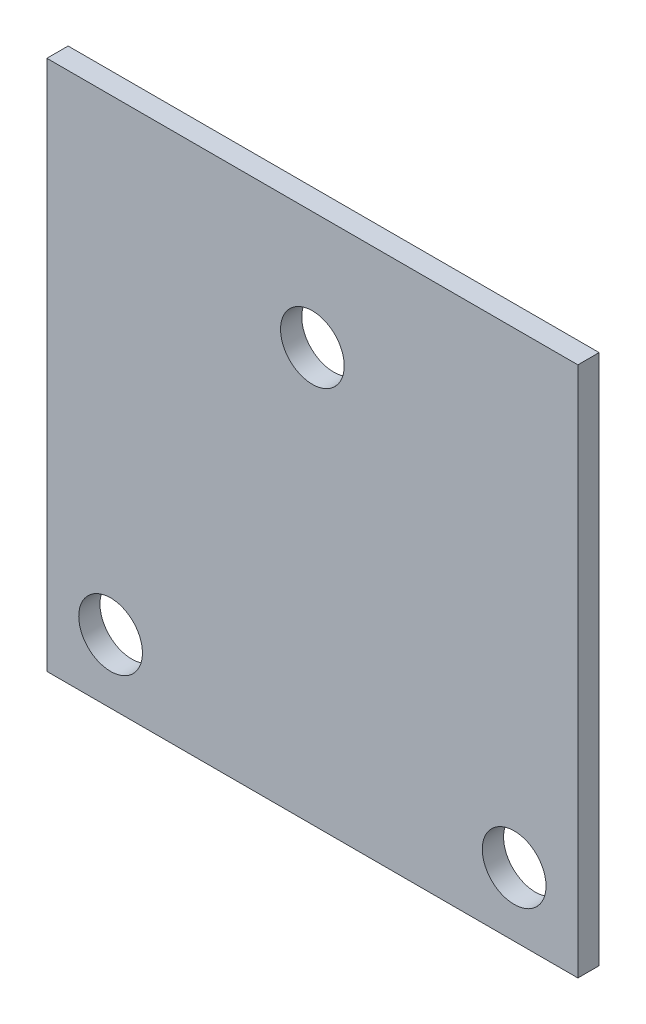
ISO-10303-21;
HEADER;
FILE_DESCRIPTION(('STEP AP214'),'2;1');
FILE_NAME('part.step','',(''),(''),'','','');
FILE_SCHEMA(('AUTOMOTIVE_DESIGN { 1 0 10303 214 1 1 1 1 }'));
ENDSEC;
DATA;
#1=APPLICATION_CONTEXT('core data for automotive mechanical design processes');
#2=APPLICATION_PROTOCOL_DEFINITION('international standard','automotive_design',2000,#1);
#3=PRODUCT_CONTEXT('',#1,'mechanical');
#4=PRODUCT('Part','Part','',(#3));
#5=PRODUCT_RELATED_PRODUCT_CATEGORY('part','',(#4));
#6=PRODUCT_DEFINITION_FORMATION('','',#4);
#7=PRODUCT_DEFINITION_CONTEXT('part definition',#1,'design');
#8=PRODUCT_DEFINITION('design','',#6,#7);
#9=PRODUCT_DEFINITION_SHAPE('','',#8);
#10=(LENGTH_UNIT() NAMED_UNIT(*) SI_UNIT(.MILLI.,.METRE.));
#11=(NAMED_UNIT(*) PLANE_ANGLE_UNIT() SI_UNIT($,.RADIAN.));
#12=(NAMED_UNIT(*) SI_UNIT($,.STERADIAN.) SOLID_ANGLE_UNIT());
#13=UNCERTAINTY_MEASURE_WITH_UNIT(LENGTH_MEASURE(1.E-05),#10,'distance_accuracy_value','');
#14=(GEOMETRIC_REPRESENTATION_CONTEXT(3) GLOBAL_UNCERTAINTY_ASSIGNED_CONTEXT((#13)) GLOBAL_UNIT_ASSIGNED_CONTEXT((#10,
#11,#12)) REPRESENTATION_CONTEXT('',''));
#15=CARTESIAN_POINT('',(0.,0.,0.));
#16=DIRECTION('',(0.,0.,1.));
#17=DIRECTION('',(1.,0.,0.));
#18=AXIS2_PLACEMENT_3D('',#15,#16,#17);
#19=CARTESIAN_POINT('',(0.,0.,1.));
#20=DIRECTION('',(0.,0.,1.));
#21=DIRECTION('',(1.,0.,0.));
#22=AXIS2_PLACEMENT_3D('',#19,#20,#21);
#23=PLANE('',#22);
#24=CARTESIAN_POINT('',(-9.5,-9.50000000000001,1.));
#25=DIRECTION('',(0.,0.,1.));
#26=DIRECTION('',(-1.,0.,0.));
#27=AXIS2_PLACEMENT_3D('',#24,#25,#26);
#28=CIRCLE('',#27,1.5);
#29=CARTESIAN_POINT('',(-11.,-9.50000000000001,1.));
#30=VERTEX_POINT('',#29);
#31=EDGE_CURVE('E138',#30,#30,#28,.T.);
#32=ORIENTED_EDGE('',*,*,#31,.F.);
#33=EDGE_LOOP('',(#32));
#34=FACE_BOUND('',#33,.T.);
#35=DIRECTION('',(0.,-1.,0.));
#36=VECTOR('',#35,1.);
#37=CARTESIAN_POINT('',(-12.5,-12.5,1.));
#38=LINE('',#37,#36);
#39=CARTESIAN_POINT('',(-12.5,12.5,1.));
#40=VERTEX_POINT('',#39);
#41=CARTESIAN_POINT('',(-12.5,-12.5,1.));
#42=VERTEX_POINT('',#41);
#43=EDGE_CURVE('E96',#40,#42,#38,.T.);
#44=ORIENTED_EDGE('',*,*,#43,.T.);
#45=DIRECTION('',(1.,0.,0.));
#46=VECTOR('',#45,1.);
#47=CARTESIAN_POINT('',(12.5,-12.5,1.));
#48=LINE('',#47,#46);
#49=CARTESIAN_POINT('',(12.5,-12.5,1.));
#50=VERTEX_POINT('',#49);
#51=EDGE_CURVE('E91',#42,#50,#48,.T.);
#52=ORIENTED_EDGE('',*,*,#51,.T.);
#53=DIRECTION('',(0.,1.,0.));
#54=VECTOR('',#53,1.);
#55=CARTESIAN_POINT('',(12.5,-12.5,1.));
#56=LINE('',#55,#54);
#57=CARTESIAN_POINT('',(12.5,12.5,1.));
#58=VERTEX_POINT('',#57);
#59=EDGE_CURVE('E94',#50,#58,#56,.T.);
#60=ORIENTED_EDGE('',*,*,#59,.T.);
#61=DIRECTION('',(-1.,0.,0.));
#62=VECTOR('',#61,1.);
#63=CARTESIAN_POINT('',(12.5,12.5,1.));
#64=LINE('',#63,#62);
#65=EDGE_CURVE('E61',#58,#40,#64,.T.);
#66=ORIENTED_EDGE('',*,*,#65,.T.);
#67=EDGE_LOOP('',(#44,#52,#60,#66));
#68=FACE_BOUND('',#67,.T.);
#69=CARTESIAN_POINT('',(9.5,-9.5,1.));
#70=DIRECTION('',(0.,0.,1.));
#71=DIRECTION('',(1.,0.,0.));
#72=AXIS2_PLACEMENT_3D('',#69,#70,#71);
#73=CIRCLE('',#72,1.5);
#74=CARTESIAN_POINT('',(11.,-9.5,1.));
#75=VERTEX_POINT('',#74);
#76=EDGE_CURVE('E116',#75,#75,#73,.T.);
#77=ORIENTED_EDGE('',*,*,#76,.F.);
#78=EDGE_LOOP('',(#77));
#79=FACE_BOUND('',#78,.T.);
#80=CARTESIAN_POINT('',(0.,6.95448267190433,1.));
#81=DIRECTION('',(0.,0.,1.));
#82=DIRECTION('',(1.,0.,0.));
#83=AXIS2_PLACEMENT_3D('',#80,#81,#82);
#84=CIRCLE('',#83,1.5);
#85=CARTESIAN_POINT('',(1.5,6.95448267190433,1.));
#86=VERTEX_POINT('',#85);
#87=EDGE_CURVE('E146',#86,#86,#84,.T.);
#88=ORIENTED_EDGE('',*,*,#87,.F.);
#89=EDGE_LOOP('',(#88));
#90=FACE_BOUND('',#89,.T.);
#91=ADVANCED_FACE('F43',(#34,#68,#79,#90),#23,.T.);
#92=CARTESIAN_POINT('',(0.,0.,0.));
#93=DIRECTION('',(0.,0.,1.));
#94=DIRECTION('',(1.,0.,0.));
#95=AXIS2_PLACEMENT_3D('',#92,#93,#94);
#96=PLANE('',#95);
#97=DIRECTION('',(0.,-1.,0.));
#98=VECTOR('',#97,1.);
#99=CARTESIAN_POINT('',(-12.5,-12.5,0.));
#100=LINE('',#99,#98);
#101=CARTESIAN_POINT('',(-12.5,12.5,0.));
#102=VERTEX_POINT('',#101);
#103=CARTESIAN_POINT('',(-12.5,-12.5,0.));
#104=VERTEX_POINT('',#103);
#105=EDGE_CURVE('E112',#102,#104,#100,.T.);
#106=ORIENTED_EDGE('',*,*,#105,.F.);
#107=DIRECTION('',(-1.,0.,0.));
#108=VECTOR('',#107,1.);
#109=CARTESIAN_POINT('',(12.5,12.5,0.));
#110=LINE('',#109,#108);
#111=CARTESIAN_POINT('',(12.5,12.5,0.));
#112=VERTEX_POINT('',#111);
#113=EDGE_CURVE('E84',#112,#102,#110,.T.);
#114=ORIENTED_EDGE('',*,*,#113,.F.);
#115=DIRECTION('',(0.,1.,0.));
#116=VECTOR('',#115,1.);
#117=CARTESIAN_POINT('',(12.5,-12.5,0.));
#118=LINE('',#117,#116);
#119=CARTESIAN_POINT('',(12.5,-12.5,0.));
#120=VERTEX_POINT('',#119);
#121=EDGE_CURVE('E78',#120,#112,#118,.T.);
#122=ORIENTED_EDGE('',*,*,#121,.F.);
#123=DIRECTION('',(1.,0.,0.));
#124=VECTOR('',#123,1.);
#125=CARTESIAN_POINT('',(12.5,-12.5,0.));
#126=LINE('',#125,#124);
#127=EDGE_CURVE('E101',#104,#120,#126,.T.);
#128=ORIENTED_EDGE('',*,*,#127,.F.);
#129=EDGE_LOOP('',(#106,#114,#122,#128));
#130=FACE_BOUND('',#129,.T.);
#131=CARTESIAN_POINT('',(9.5,-9.5,0.));
#132=DIRECTION('',(0.,0.,1.));
#133=DIRECTION('',(1.,0.,0.));
#134=AXIS2_PLACEMENT_3D('',#131,#132,#133);
#135=CIRCLE('',#134,1.5);
#136=CARTESIAN_POINT('',(11.,-9.5,0.));
#137=VERTEX_POINT('',#136);
#138=EDGE_CURVE('E134',#137,#137,#135,.T.);
#139=ORIENTED_EDGE('',*,*,#138,.T.);
#140=EDGE_LOOP('',(#139));
#141=FACE_BOUND('',#140,.T.);
#142=CARTESIAN_POINT('',(-9.5,-9.50000000000001,0.));
#143=DIRECTION('',(0.,0.,1.));
#144=DIRECTION('',(-1.,0.,0.));
#145=AXIS2_PLACEMENT_3D('',#142,#143,#144);
#146=CIRCLE('',#145,1.5);
#147=CARTESIAN_POINT('',(-11.,-9.50000000000001,0.));
#148=VERTEX_POINT('',#147);
#149=EDGE_CURVE('E142',#148,#148,#146,.T.);
#150=ORIENTED_EDGE('',*,*,#149,.T.);
#151=EDGE_LOOP('',(#150));
#152=FACE_BOUND('',#151,.T.);
#153=CARTESIAN_POINT('',(0.,6.95448267190433,0.));
#154=DIRECTION('',(0.,0.,1.));
#155=DIRECTION('',(1.,0.,0.));
#156=AXIS2_PLACEMENT_3D('',#153,#154,#155);
#157=CIRCLE('',#156,1.5);
#158=CARTESIAN_POINT('',(1.5,6.95448267190433,0.));
#159=VERTEX_POINT('',#158);
#160=EDGE_CURVE('E150',#159,#159,#157,.T.);
#161=ORIENTED_EDGE('',*,*,#160,.T.);
#162=EDGE_LOOP('',(#161));
#163=FACE_BOUND('',#162,.T.);
#164=ADVANCED_FACE('F129',(#130,#141,#152,#163),#96,.F.);
#165=CARTESIAN_POINT('',(-12.5,-12.5,1.));
#166=DIRECTION('',(1.,0.,0.));
#167=DIRECTION('',(0.,0.,-1.));
#168=AXIS2_PLACEMENT_3D('',#165,#166,#167);
#169=PLANE('',#168);
#170=ORIENTED_EDGE('',*,*,#105,.T.);
#171=DIRECTION('',(0.,0.,-1.));
#172=VECTOR('',#171,1.);
#173=CARTESIAN_POINT('',(-12.5,-12.5,1.));
#174=LINE('',#173,#172);
#175=EDGE_CURVE('E11',#42,#104,#174,.T.);
#176=ORIENTED_EDGE('',*,*,#175,.F.);
#177=ORIENTED_EDGE('',*,*,#43,.F.);
#178=DIRECTION('',(0.,0.,-1.));
#179=VECTOR('',#178,1.);
#180=CARTESIAN_POINT('',(-12.5,12.5,1.));
#181=LINE('',#180,#179);
#182=EDGE_CURVE('E108',#40,#102,#181,.T.);
#183=ORIENTED_EDGE('',*,*,#182,.T.);
#184=EDGE_LOOP('',(#170,#176,#177,#183));
#185=FACE_BOUND('',#184,.T.);
#186=ADVANCED_FACE('F45',(#185),#169,.F.);
#187=CARTESIAN_POINT('',(12.5,-12.5,1.));
#188=DIRECTION('',(0.,1.,0.));
#189=DIRECTION('',(-1.,0.,0.));
#190=AXIS2_PLACEMENT_3D('',#187,#188,#189);
#191=PLANE('',#190);
#192=ORIENTED_EDGE('',*,*,#127,.T.);
#193=DIRECTION('',(0.,0.,-1.));
#194=VECTOR('',#193,1.);
#195=CARTESIAN_POINT('',(12.5,-12.5,1.));
#196=LINE('',#195,#194);
#197=EDGE_CURVE('E53',#50,#120,#196,.T.);
#198=ORIENTED_EDGE('',*,*,#197,.F.);
#199=ORIENTED_EDGE('',*,*,#51,.F.);
#200=ORIENTED_EDGE('',*,*,#175,.T.);
#201=EDGE_LOOP('',(#192,#198,#199,#200));
#202=FACE_BOUND('',#201,.T.);
#203=ADVANCED_FACE('F100',(#202),#191,.F.);
#204=CARTESIAN_POINT('',(12.5,-12.5,1.));
#205=DIRECTION('',(-1.,0.,0.));
#206=DIRECTION('',(0.,0.,1.));
#207=AXIS2_PLACEMENT_3D('',#204,#205,#206);
#208=PLANE('',#207);
#209=ORIENTED_EDGE('',*,*,#121,.T.);
#210=DIRECTION('',(0.,0.,-1.));
#211=VECTOR('',#210,1.);
#212=CARTESIAN_POINT('',(12.5,12.5,1.));
#213=LINE('',#212,#211);
#214=EDGE_CURVE('E103',#58,#112,#213,.T.);
#215=ORIENTED_EDGE('',*,*,#214,.F.);
#216=ORIENTED_EDGE('',*,*,#59,.F.);
#217=ORIENTED_EDGE('',*,*,#197,.T.);
#218=EDGE_LOOP('',(#209,#215,#216,#217));
#219=FACE_BOUND('',#218,.T.);
#220=ADVANCED_FACE('F104',(#219),#208,.F.);
#221=CARTESIAN_POINT('',(12.5,12.5,1.));
#222=DIRECTION('',(0.,-1.,0.));
#223=DIRECTION('',(1.,0.,0.));
#224=AXIS2_PLACEMENT_3D('',#221,#222,#223);
#225=PLANE('',#224);
#226=ORIENTED_EDGE('',*,*,#113,.T.);
#227=ORIENTED_EDGE('',*,*,#182,.F.);
#228=ORIENTED_EDGE('',*,*,#65,.F.);
#229=ORIENTED_EDGE('',*,*,#214,.T.);
#230=EDGE_LOOP('',(#226,#227,#228,#229));
#231=FACE_BOUND('',#230,.T.);
#232=ADVANCED_FACE('F126',(#231),#225,.F.);
#233=CARTESIAN_POINT('',(9.5,-9.5,1.));
#234=DIRECTION('',(0.,0.,-1.));
#235=DIRECTION('',(-1.,0.,0.));
#236=AXIS2_PLACEMENT_3D('',#233,#234,#235);
#237=CYLINDRICAL_SURFACE('',#236,1.5);
#238=ORIENTED_EDGE('',*,*,#76,.T.);
#239=EDGE_LOOP('',(#238));
#240=FACE_BOUND('',#239,.T.);
#241=ORIENTED_EDGE('',*,*,#138,.F.);
#242=EDGE_LOOP('',(#241));
#243=FACE_BOUND('',#242,.T.);
#244=ADVANCED_FACE('F170',(#240,#243),#237,.F.);
#245=CARTESIAN_POINT('',(-9.5,-9.50000000000001,1.));
#246=DIRECTION('',(0.,0.,-1.));
#247=DIRECTION('',(-1.,0.,0.));
#248=AXIS2_PLACEMENT_3D('',#245,#246,#247);
#249=CYLINDRICAL_SURFACE('',#248,1.5);
#250=ORIENTED_EDGE('',*,*,#31,.T.);
#251=EDGE_LOOP('',(#250));
#252=FACE_BOUND('',#251,.T.);
#253=ORIENTED_EDGE('',*,*,#149,.F.);
#254=EDGE_LOOP('',(#253));
#255=FACE_BOUND('',#254,.T.);
#256=ADVANCED_FACE('F224',(#252,#255),#249,.F.);
#257=CARTESIAN_POINT('',(0.,6.95448267190433,1.));
#258=DIRECTION('',(0.,0.,-1.));
#259=DIRECTION('',(-1.,0.,0.));
#260=AXIS2_PLACEMENT_3D('',#257,#258,#259);
#261=CYLINDRICAL_SURFACE('',#260,1.5);
#262=ORIENTED_EDGE('',*,*,#87,.T.);
#263=EDGE_LOOP('',(#262));
#264=FACE_BOUND('',#263,.T.);
#265=ORIENTED_EDGE('',*,*,#160,.F.);
#266=EDGE_LOOP('',(#265));
#267=FACE_BOUND('',#266,.T.);
#268=ADVANCED_FACE('F158',(#264,#267),#261,.F.);
#269=CLOSED_SHELL('',(#91,#164,#186,#203,#220,#232,#244,#256,#268));
#270=MANIFOLD_SOLID_BREP('B2',#269);
#271=ADVANCED_BREP_SHAPE_REPRESENTATION('',(#18,#270),#14);
#272=SHAPE_DEFINITION_REPRESENTATION(#9,#271);
ENDSEC;
END-ISO-10303-21;
